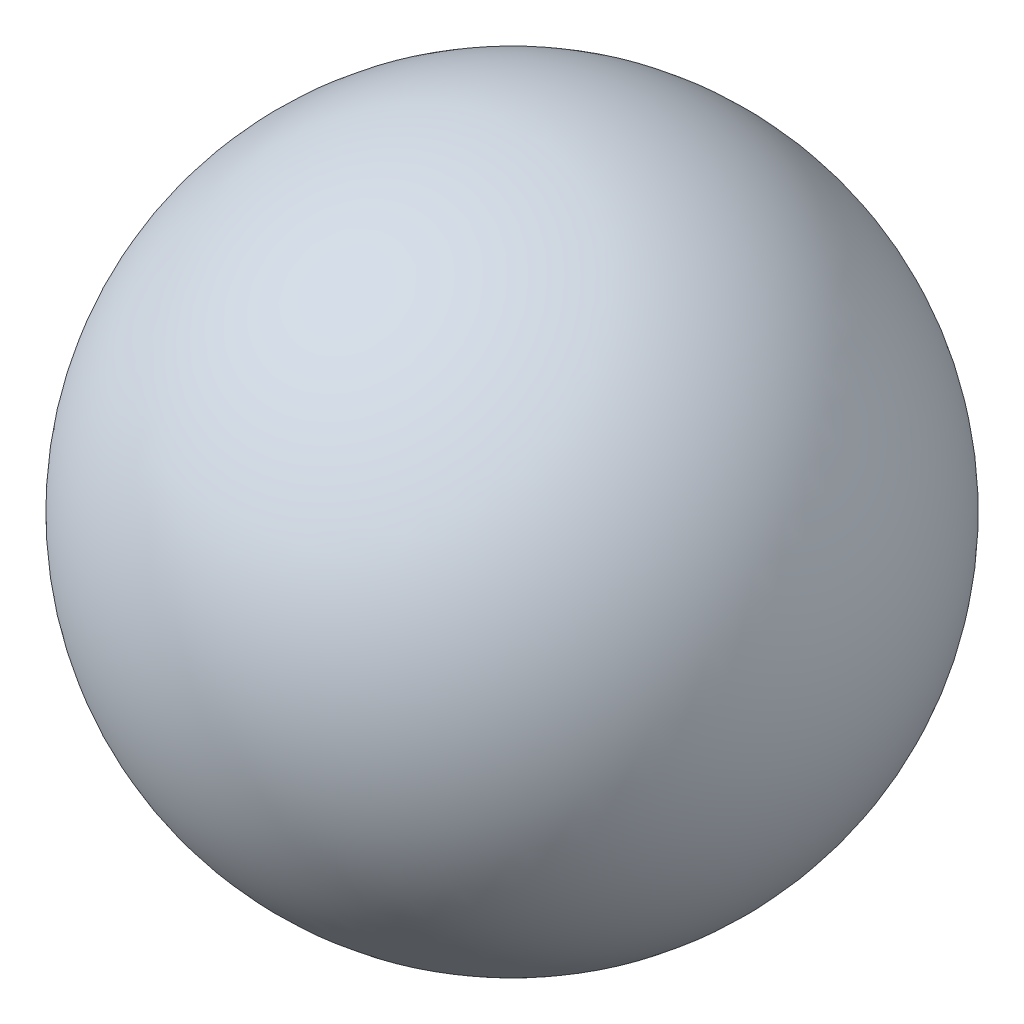
ISO-10303-21;
HEADER;
FILE_DESCRIPTION(('STEP AP214'),'2;1');
FILE_NAME('part.step','',(''),(''),'','','');
FILE_SCHEMA(('AUTOMOTIVE_DESIGN { 1 0 10303 214 1 1 1 1 }'));
ENDSEC;
DATA;
#1=APPLICATION_CONTEXT('core data for automotive mechanical design processes');
#2=APPLICATION_PROTOCOL_DEFINITION('international standard','automotive_design',2000,#1);
#3=PRODUCT_CONTEXT('',#1,'mechanical');
#4=PRODUCT('Part','Part','',(#3));
#5=PRODUCT_RELATED_PRODUCT_CATEGORY('part','',(#4));
#6=PRODUCT_DEFINITION_FORMATION('','',#4);
#7=PRODUCT_DEFINITION_CONTEXT('part definition',#1,'design');
#8=PRODUCT_DEFINITION('design','',#6,#7);
#9=PRODUCT_DEFINITION_SHAPE('','',#8);
#10=(LENGTH_UNIT() NAMED_UNIT(*) SI_UNIT(.MILLI.,.METRE.));
#11=(NAMED_UNIT(*) PLANE_ANGLE_UNIT() SI_UNIT($,.RADIAN.));
#12=(NAMED_UNIT(*) SI_UNIT($,.STERADIAN.) SOLID_ANGLE_UNIT());
#13=UNCERTAINTY_MEASURE_WITH_UNIT(LENGTH_MEASURE(1.E-05),#10,'distance_accuracy_value','');
#14=(GEOMETRIC_REPRESENTATION_CONTEXT(3) GLOBAL_UNCERTAINTY_ASSIGNED_CONTEXT((#13)) GLOBAL_UNIT_ASSIGNED_CONTEXT((#10,
#11,#12)) REPRESENTATION_CONTEXT('',''));
#15=CARTESIAN_POINT('',(0.,0.,0.));
#16=DIRECTION('',(0.,0.,1.));
#17=DIRECTION('',(1.,0.,0.));
#18=AXIS2_PLACEMENT_3D('',#15,#16,#17);
#19=CARTESIAN_POINT('',(0.,0.,0.));
#20=DIRECTION('',(0.,1.,0.));
#21=DIRECTION('',(1.,0.,0.));
#22=AXIS2_PLACEMENT_3D('',#19,#20,#21);
#23=SPHERICAL_SURFACE('',#22,11.);
#24=CARTESIAN_POINT('',(0.,11.,0.));
#25=VERTEX_POINT('',#24);
#26=VERTEX_LOOP('',#25);
#27=FACE_BOUND('',#26,.T.);
#28=ADVANCED_FACE('F35',(#27),#23,.T.);
#29=CLOSED_SHELL('',(#28));
#30=MANIFOLD_SOLID_BREP('B2',#29);
#31=ADVANCED_BREP_SHAPE_REPRESENTATION('',(#18,#30),#14);
#32=SHAPE_DEFINITION_REPRESENTATION(#9,#31);
ENDSEC;
END-ISO-10303-21;
